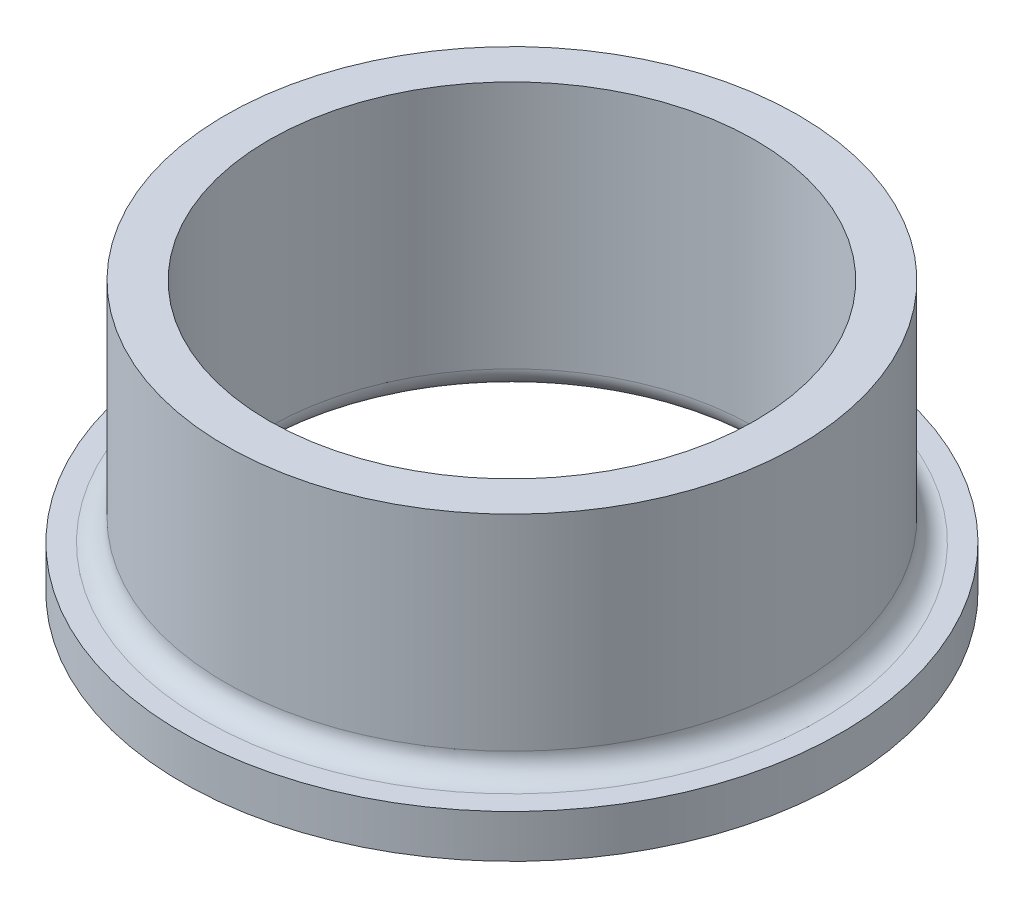
ISO-10303-21;
HEADER;
FILE_DESCRIPTION(('STEP AP214'),'2;1');
FILE_NAME('part.step','',(''),(''),'','','');
FILE_SCHEMA(('AUTOMOTIVE_DESIGN { 1 0 10303 214 1 1 1 1 }'));
ENDSEC;
DATA;
#1=APPLICATION_CONTEXT('core data for automotive mechanical design processes');
#2=APPLICATION_PROTOCOL_DEFINITION('international standard','automotive_design',2000,#1);
#3=PRODUCT_CONTEXT('',#1,'mechanical');
#4=PRODUCT('Part','Part','',(#3));
#5=PRODUCT_RELATED_PRODUCT_CATEGORY('part','',(#4));
#6=PRODUCT_DEFINITION_FORMATION('','',#4);
#7=PRODUCT_DEFINITION_CONTEXT('part definition',#1,'design');
#8=PRODUCT_DEFINITION('design','',#6,#7);
#9=PRODUCT_DEFINITION_SHAPE('','',#8);
#10=(LENGTH_UNIT() NAMED_UNIT(*) SI_UNIT(.MILLI.,.METRE.));
#11=(NAMED_UNIT(*) PLANE_ANGLE_UNIT() SI_UNIT($,.RADIAN.));
#12=(NAMED_UNIT(*) SI_UNIT($,.STERADIAN.) SOLID_ANGLE_UNIT());
#13=UNCERTAINTY_MEASURE_WITH_UNIT(LENGTH_MEASURE(1.E-05),#10,'distance_accuracy_value','');
#14=(GEOMETRIC_REPRESENTATION_CONTEXT(3) GLOBAL_UNCERTAINTY_ASSIGNED_CONTEXT((#13)) GLOBAL_UNIT_ASSIGNED_CONTEXT((#10,
#11,#12)) REPRESENTATION_CONTEXT('',''));
#15=CARTESIAN_POINT('',(0.,0.,0.));
#16=DIRECTION('',(0.,0.,1.));
#17=DIRECTION('',(1.,0.,0.));
#18=AXIS2_PLACEMENT_3D('',#15,#16,#17);
#19=CARTESIAN_POINT('',(26.5,25.,0.));
#20=DIRECTION('',(0.,1.,0.));
#21=DIRECTION('',(0.,0.,1.));
#22=AXIS2_PLACEMENT_3D('',#19,#20,#21);
#23=PLANE('',#22);
#24=CARTESIAN_POINT('',(0.,25.,0.));
#25=DIRECTION('',(0.,-1.,0.));
#26=DIRECTION('',(0.,0.,-1.));
#27=AXIS2_PLACEMENT_3D('',#24,#25,#26);
#28=CIRCLE('',#27,22.5);
#29=CARTESIAN_POINT('',(0.,25.,-22.5));
#30=VERTEX_POINT('',#29);
#31=EDGE_CURVE('E10',#30,#30,#28,.T.);
#32=ORIENTED_EDGE('',*,*,#31,.T.);
#33=EDGE_LOOP('',(#32));
#34=FACE_BOUND('',#33,.T.);
#35=CARTESIAN_POINT('',(0.,25.,0.));
#36=DIRECTION('',(0.,-1.,0.));
#37=DIRECTION('',(0.,0.,-1.));
#38=AXIS2_PLACEMENT_3D('',#35,#36,#37);
#39=CIRCLE('',#38,26.5);
#40=CARTESIAN_POINT('',(0.,25.,-26.5));
#41=VERTEX_POINT('',#40);
#42=EDGE_CURVE('E59',#41,#41,#39,.T.);
#43=ORIENTED_EDGE('',*,*,#42,.F.);
#44=EDGE_LOOP('',(#43));
#45=FACE_BOUND('',#44,.T.);
#46=ADVANCED_FACE('F31',(#34,#45),#23,.T.);
#47=CARTESIAN_POINT('',(0.,0.,0.));
#48=DIRECTION('',(0.,-1.,0.));
#49=DIRECTION('',(0.,0.,-1.));
#50=AXIS2_PLACEMENT_3D('',#47,#48,#49);
#51=CYLINDRICAL_SURFACE('',#50,22.5);
#52=CARTESIAN_POINT('',(0.,2.,0.));
#53=DIRECTION('',(0.,-1.,0.));
#54=DIRECTION('',(0.,0.,-1.));
#55=AXIS2_PLACEMENT_3D('',#52,#53,#54);
#56=CIRCLE('',#55,22.5);
#57=CARTESIAN_POINT('',(0.,2.,-22.5));
#58=VERTEX_POINT('',#57);
#59=EDGE_CURVE('E37',#58,#58,#56,.T.);
#60=ORIENTED_EDGE('',*,*,#59,.T.);
#61=EDGE_LOOP('',(#60));
#62=FACE_BOUND('',#61,.T.);
#63=ORIENTED_EDGE('',*,*,#31,.F.);
#64=EDGE_LOOP('',(#63));
#65=FACE_BOUND('',#64,.T.);
#66=ADVANCED_FACE('F67',(#62,#65),#51,.F.);
#67=CARTESIAN_POINT('',(0.,2.,0.));
#68=DIRECTION('',(0.,-1.,0.));
#69=DIRECTION('',(0.,0.,-1.));
#70=AXIS2_PLACEMENT_3D('',#67,#68,#69);
#71=TOROIDAL_SURFACE('',#70,24.5,2.);
#72=CARTESIAN_POINT('',(0.,0.,0.));
#73=DIRECTION('',(0.,-1.,0.));
#74=DIRECTION('',(0.,0.,-1.));
#75=AXIS2_PLACEMENT_3D('',#72,#73,#74);
#76=CIRCLE('',#75,24.5);
#77=CARTESIAN_POINT('',(0.,0.,-24.5));
#78=VERTEX_POINT('',#77);
#79=EDGE_CURVE('E41',#78,#78,#76,.T.);
#80=ORIENTED_EDGE('',*,*,#79,.T.);
#81=EDGE_LOOP('',(#80));
#82=FACE_BOUND('',#81,.T.);
#83=ORIENTED_EDGE('',*,*,#59,.F.);
#84=EDGE_LOOP('',(#83));
#85=FACE_BOUND('',#84,.T.);
#86=ADVANCED_FACE('F71',(#82,#85),#71,.T.);
#87=CARTESIAN_POINT('',(24.5,0.,0.));
#88=DIRECTION('',(0.,-1.,0.));
#89=DIRECTION('',(0.,0.,-1.));
#90=AXIS2_PLACEMENT_3D('',#87,#88,#89);
#91=PLANE('',#90);
#92=CARTESIAN_POINT('',(0.,0.,0.));
#93=DIRECTION('',(0.,-1.,0.));
#94=DIRECTION('',(0.,0.,-1.));
#95=AXIS2_PLACEMENT_3D('',#92,#93,#94);
#96=CIRCLE('',#95,30.5);
#97=CARTESIAN_POINT('',(0.,0.,-30.5));
#98=VERTEX_POINT('',#97);
#99=EDGE_CURVE('E45',#98,#98,#96,.T.);
#100=ORIENTED_EDGE('',*,*,#99,.T.);
#101=EDGE_LOOP('',(#100));
#102=FACE_BOUND('',#101,.T.);
#103=ORIENTED_EDGE('',*,*,#79,.F.);
#104=EDGE_LOOP('',(#103));
#105=FACE_BOUND('',#104,.T.);
#106=ADVANCED_FACE('F75',(#102,#105),#91,.T.);
#107=CARTESIAN_POINT('',(0.,0.,0.));
#108=DIRECTION('',(0.,-1.,0.));
#109=DIRECTION('',(0.,0.,-1.));
#110=AXIS2_PLACEMENT_3D('',#107,#108,#109);
#111=CYLINDRICAL_SURFACE('',#110,30.5);
#112=CARTESIAN_POINT('',(0.,4.,0.));
#113=DIRECTION('',(0.,-1.,0.));
#114=DIRECTION('',(0.,0.,-1.));
#115=AXIS2_PLACEMENT_3D('',#112,#113,#114);
#116=CIRCLE('',#115,30.5);
#117=CARTESIAN_POINT('',(0.,4.,-30.5));
#118=VERTEX_POINT('',#117);
#119=EDGE_CURVE('E50',#118,#118,#116,.T.);
#120=ORIENTED_EDGE('',*,*,#119,.T.);
#121=EDGE_LOOP('',(#120));
#122=FACE_BOUND('',#121,.T.);
#123=ORIENTED_EDGE('',*,*,#99,.F.);
#124=EDGE_LOOP('',(#123));
#125=FACE_BOUND('',#124,.T.);
#126=ADVANCED_FACE('F82',(#122,#125),#111,.T.);
#127=CARTESIAN_POINT('',(30.5,4.,0.));
#128=DIRECTION('',(0.,1.,0.));
#129=DIRECTION('',(0.,0.,1.));
#130=AXIS2_PLACEMENT_3D('',#127,#128,#129);
#131=PLANE('',#130);
#132=CARTESIAN_POINT('',(0.,4.,0.));
#133=DIRECTION('',(0.,-1.,0.));
#134=DIRECTION('',(0.,0.,-1.));
#135=AXIS2_PLACEMENT_3D('',#132,#133,#134);
#136=CIRCLE('',#135,28.5);
#137=CARTESIAN_POINT('',(0.,4.,-28.5));
#138=VERTEX_POINT('',#137);
#139=EDGE_CURVE('E53',#138,#138,#136,.T.);
#140=ORIENTED_EDGE('',*,*,#139,.T.);
#141=EDGE_LOOP('',(#140));
#142=FACE_BOUND('',#141,.T.);
#143=ORIENTED_EDGE('',*,*,#119,.F.);
#144=EDGE_LOOP('',(#143));
#145=FACE_BOUND('',#144,.T.);
#146=ADVANCED_FACE('F86',(#142,#145),#131,.T.);
#147=CARTESIAN_POINT('',(0.,6.,0.));
#148=DIRECTION('',(0.,-1.,0.));
#149=DIRECTION('',(0.,0.,-1.));
#150=AXIS2_PLACEMENT_3D('',#147,#148,#149);
#151=TOROIDAL_SURFACE('',#150,28.5,2.);
#152=CARTESIAN_POINT('',(0.,6.,0.));
#153=DIRECTION('',(0.,-1.,0.));
#154=DIRECTION('',(0.,0.,-1.));
#155=AXIS2_PLACEMENT_3D('',#152,#153,#154);
#156=CIRCLE('',#155,26.5);
#157=CARTESIAN_POINT('',(0.,6.,-26.5));
#158=VERTEX_POINT('',#157);
#159=EDGE_CURVE('E56',#158,#158,#156,.T.);
#160=ORIENTED_EDGE('',*,*,#159,.T.);
#161=EDGE_LOOP('',(#160));
#162=FACE_BOUND('',#161,.T.);
#163=ORIENTED_EDGE('',*,*,#139,.F.);
#164=EDGE_LOOP('',(#163));
#165=FACE_BOUND('',#164,.T.);
#166=ADVANCED_FACE('F90',(#162,#165),#151,.F.);
#167=CARTESIAN_POINT('',(0.,0.,0.));
#168=DIRECTION('',(0.,-1.,0.));
#169=DIRECTION('',(0.,0.,-1.));
#170=AXIS2_PLACEMENT_3D('',#167,#168,#169);
#171=CYLINDRICAL_SURFACE('',#170,26.5);
#172=ORIENTED_EDGE('',*,*,#42,.T.);
#173=EDGE_LOOP('',(#172));
#174=FACE_BOUND('',#173,.T.);
#175=ORIENTED_EDGE('',*,*,#159,.F.);
#176=EDGE_LOOP('',(#175));
#177=FACE_BOUND('',#176,.T.);
#178=ADVANCED_FACE('F63',(#174,#177),#171,.T.);
#179=CLOSED_SHELL('',(#46,#66,#86,#106,#126,#146,#166,#178));
#180=MANIFOLD_SOLID_BREP('B2',#179);
#181=ADVANCED_BREP_SHAPE_REPRESENTATION('',(#18,#180),#14);
#182=SHAPE_DEFINITION_REPRESENTATION(#9,#181);
ENDSEC;
END-ISO-10303-21;
